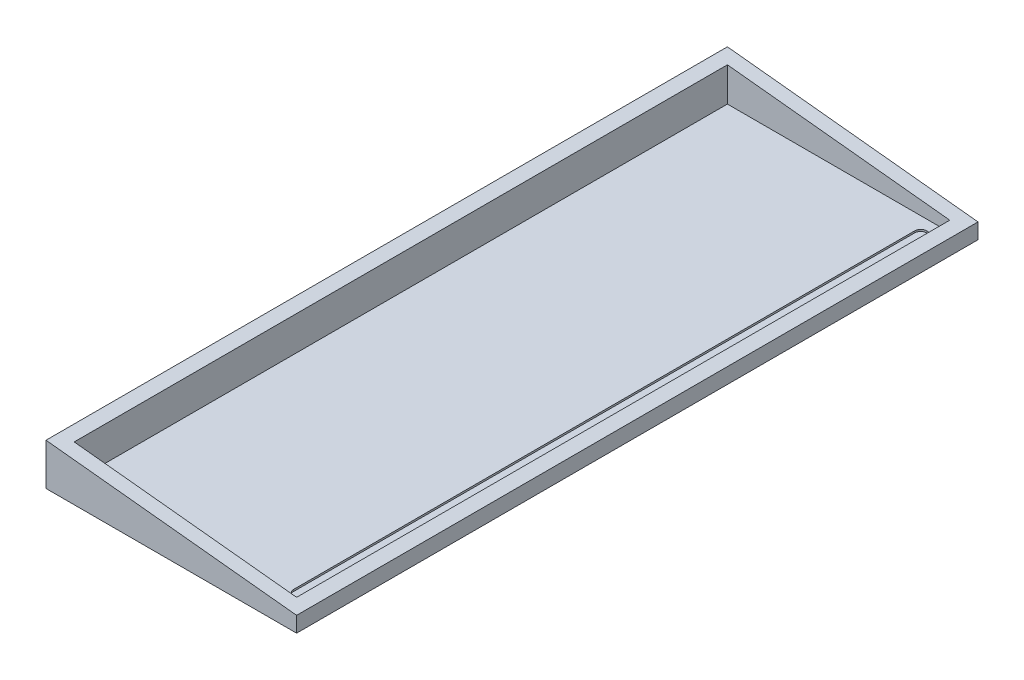
ISO-10303-21;
HEADER;
FILE_DESCRIPTION(('STEP AP214'),'2;1');
FILE_NAME('part.step','',(''),(''),'','','');
FILE_SCHEMA(('AUTOMOTIVE_DESIGN { 1 0 10303 214 1 1 1 1 }'));
ENDSEC;
DATA;
#1=APPLICATION_CONTEXT('core data for automotive mechanical design processes');
#2=APPLICATION_PROTOCOL_DEFINITION('international standard','automotive_design',2000,#1);
#3=PRODUCT_CONTEXT('',#1,'mechanical');
#4=PRODUCT('Part','Part','',(#3));
#5=PRODUCT_RELATED_PRODUCT_CATEGORY('part','',(#4));
#6=PRODUCT_DEFINITION_FORMATION('','',#4);
#7=PRODUCT_DEFINITION_CONTEXT('part definition',#1,'design');
#8=PRODUCT_DEFINITION('design','',#6,#7);
#9=PRODUCT_DEFINITION_SHAPE('','',#8);
#10=(LENGTH_UNIT() NAMED_UNIT(*) SI_UNIT(.MILLI.,.METRE.));
#11=(NAMED_UNIT(*) PLANE_ANGLE_UNIT() SI_UNIT($,.RADIAN.));
#12=(NAMED_UNIT(*) SI_UNIT($,.STERADIAN.) SOLID_ANGLE_UNIT());
#13=UNCERTAINTY_MEASURE_WITH_UNIT(LENGTH_MEASURE(1.E-05),#10,'distance_accuracy_value','');
#14=(GEOMETRIC_REPRESENTATION_CONTEXT(3) GLOBAL_UNCERTAINTY_ASSIGNED_CONTEXT((#13)) GLOBAL_UNIT_ASSIGNED_CONTEXT((#10,
#11,#12)) REPRESENTATION_CONTEXT('',''));
#15=CARTESIAN_POINT('',(0.,0.,0.));
#16=DIRECTION('',(0.,0.,1.));
#17=DIRECTION('',(1.,0.,0.));
#18=AXIS2_PLACEMENT_3D('',#15,#16,#17);
#19=CARTESIAN_POINT('',(1.80331095467036,15.6573576470199,0.));
#20=DIRECTION('',(0.104528463267646,0.994521895368274,0.));
#21=DIRECTION('',(-0.994521895368274,0.104528463267646,0.));
#22=AXIS2_PLACEMENT_3D('',#19,#20,#21);
#23=PLANE('',#22);
#24=DIRECTION('',(1.51465987561138E-13,0.,1.));
#25=VECTOR('',#24,1.);
#26=CARTESIAN_POINT('',(-61.4999999999144,22.3108037346864,9.6942194870283E-12));
#27=LINE('',#26,#25);
#28=CARTESIAN_POINT('',(-61.4999999999707,22.3108037346923,-372.27000000002));
#29=VERTEX_POINT('',#28);
#30=CARTESIAN_POINT('',(-61.499999999916,22.3108037346866,-11.0000000000191));
#31=VERTEX_POINT('',#30);
#32=EDGE_CURVE('E235',#29,#31,#27,.T.);
#33=ORIENTED_EDGE('',*,*,#32,.F.);
#34=DIRECTION('',(-0.994521895368274,0.104528463267646,0.));
#35=VECTOR('',#34,1.);
#36=CARTESIAN_POINT('',(1.80331095467036,15.6573576470199,-372.27000000002));
#37=LINE('',#36,#35);
#38=CARTESIAN_POINT('',(61.4999999999718,9.38298279702108,-372.27000000002));
#39=VERTEX_POINT('',#38);
#40=EDGE_CURVE('E162',#39,#29,#37,.T.);
#41=ORIENTED_EDGE('',*,*,#40,.F.);
#42=DIRECTION('',(0.,0.,-1.));
#43=VECTOR('',#42,1.);
#44=CARTESIAN_POINT('',(61.4999999999718,9.38298279702108,0.));
#45=LINE('',#44,#43);
#46=CARTESIAN_POINT('',(61.4999999999718,9.38298279702108,-11.0000000000191));
#47=VERTEX_POINT('',#46);
#48=EDGE_CURVE('E230',#47,#39,#45,.T.);
#49=ORIENTED_EDGE('',*,*,#48,.F.);
#50=DIRECTION('',(0.994521895368274,-0.104528463267646,0.));
#51=VECTOR('',#50,1.);
#52=CARTESIAN_POINT('',(1.80331095467036,15.6573576470199,-11.0000000000191));
#53=LINE('',#52,#51);
#54=EDGE_CURVE('E233',#31,#47,#53,.T.);
#55=ORIENTED_EDGE('',*,*,#54,.F.);
#56=EDGE_LOOP('',(#33,#41,#49,#55));
#57=FACE_BOUND('',#56,.T.);
#58=DIRECTION('',(-0.994521895368274,0.104528463267646,0.));
#59=VECTOR('',#58,1.);
#60=CARTESIAN_POINT('',(26.6325870070884,13.0476955753304,-3.19999999999993));
#61=LINE('',#60,#59);
#62=CARTESIAN_POINT('',(69.3,8.56316976194593,-3.19999999999993));
#63=VERTEX_POINT('',#62);
#64=CARTESIAN_POINT('',(-69.3,23.1306167697676,-3.19999999999993));
#65=VERTEX_POINT('',#64);
#66=EDGE_CURVE('E213',#63,#65,#61,.T.);
#67=ORIENTED_EDGE('',*,*,#66,.F.);
#68=DIRECTION('',(0.,0.,1.));
#69=VECTOR('',#68,1.);
#70=CARTESIAN_POINT('',(69.3,8.56316976194593,-380.07));
#71=LINE('',#70,#69);
#72=CARTESIAN_POINT('',(69.3,8.56316976194592,-380.07));
#73=VERTEX_POINT('',#72);
#74=EDGE_CURVE('E218',#73,#63,#71,.T.);
#75=ORIENTED_EDGE('',*,*,#74,.F.);
#76=DIRECTION('',(0.994521895368274,-0.104528463267646,0.));
#77=VECTOR('',#76,1.);
#78=CARTESIAN_POINT('',(-110.453041723765,27.4559757490001,-380.07));
#79=LINE('',#78,#77);
#80=CARTESIAN_POINT('',(-69.3,23.1306167697677,-380.07));
#81=VERTEX_POINT('',#80);
#82=EDGE_CURVE('E222',#81,#73,#79,.T.);
#83=ORIENTED_EDGE('',*,*,#82,.F.);
#84=DIRECTION('',(0.,0.,-1.));
#85=VECTOR('',#84,1.);
#86=CARTESIAN_POINT('',(-69.3,23.1306167697676,-3.19999999999993));
#87=LINE('',#86,#85);
#88=EDGE_CURVE('E201',#65,#81,#87,.T.);
#89=ORIENTED_EDGE('',*,*,#88,.F.);
#90=EDGE_LOOP('',(#67,#75,#83,#89));
#91=FACE_BOUND('',#90,.T.);
#92=ADVANCED_FACE('F45',(#57,#91),#23,.T.);
#93=CARTESIAN_POINT('',(0.,0.,0.));
#94=DIRECTION('',(0.,-1.,0.));
#95=DIRECTION('',(1.,0.,0.));
#96=AXIS2_PLACEMENT_3D('',#93,#94,#95);
#97=PLANE('',#96);
#98=DIRECTION('',(-1.,0.,0.));
#99=VECTOR('',#98,1.);
#100=CARTESIAN_POINT('',(69.3,0.,-3.19999999999993));
#101=LINE('',#100,#99);
#102=CARTESIAN_POINT('',(69.3,0.,-3.19999999999993));
#103=VERTEX_POINT('',#102);
#104=CARTESIAN_POINT('',(-69.3,0.,-3.19999999999993));
#105=VERTEX_POINT('',#104);
#106=EDGE_CURVE('E194',#103,#105,#101,.T.);
#107=ORIENTED_EDGE('',*,*,#106,.T.);
#108=DIRECTION('',(0.,0.,-1.));
#109=VECTOR('',#108,1.);
#110=CARTESIAN_POINT('',(-69.3,0.,-3.19999999999993));
#111=LINE('',#110,#109);
#112=CARTESIAN_POINT('',(-69.3,0.,-380.07));
#113=VERTEX_POINT('',#112);
#114=EDGE_CURVE('E205',#105,#113,#111,.T.);
#115=ORIENTED_EDGE('',*,*,#114,.T.);
#116=DIRECTION('',(1.,0.,0.));
#117=VECTOR('',#116,1.);
#118=CARTESIAN_POINT('',(-69.3,0.,-380.07));
#119=LINE('',#118,#117);
#120=CARTESIAN_POINT('',(69.3,0.,-380.07));
#121=VERTEX_POINT('',#120);
#122=EDGE_CURVE('E202',#113,#121,#119,.T.);
#123=ORIENTED_EDGE('',*,*,#122,.T.);
#124=DIRECTION('',(0.,0.,1.));
#125=VECTOR('',#124,1.);
#126=CARTESIAN_POINT('',(69.3,0.,-380.07));
#127=LINE('',#126,#125);
#128=EDGE_CURVE('E198',#121,#103,#127,.T.);
#129=ORIENTED_EDGE('',*,*,#128,.T.);
#130=EDGE_LOOP('',(#107,#115,#123,#129));
#131=FACE_BOUND('',#130,.T.);
#132=ADVANCED_FACE('F320',(#131),#97,.T.);
#133=CARTESIAN_POINT('',(-69.3,419.001013108752,-3.19999999999993));
#134=DIRECTION('',(-1.,0.,0.));
#135=DIRECTION('',(0.,0.,1.));
#136=AXIS2_PLACEMENT_3D('',#133,#134,#135);
#137=PLANE('',#136);
#138=DIRECTION('',(0.,-1.,0.));
#139=VECTOR('',#138,1.);
#140=CARTESIAN_POINT('',(-69.3,419.001013108752,-3.19999999999993));
#141=LINE('',#140,#139);
#142=EDGE_CURVE('E216',#65,#105,#141,.T.);
#143=ORIENTED_EDGE('',*,*,#142,.F.);
#144=ORIENTED_EDGE('',*,*,#88,.T.);
#145=DIRECTION('',(0.,-1.,0.));
#146=VECTOR('',#145,1.);
#147=CARTESIAN_POINT('',(-69.3,419.001013108752,-380.07));
#148=LINE('',#147,#146);
#149=EDGE_CURVE('E212',#81,#113,#148,.T.);
#150=ORIENTED_EDGE('',*,*,#149,.T.);
#151=ORIENTED_EDGE('',*,*,#114,.F.);
#152=EDGE_LOOP('',(#143,#144,#150,#151));
#153=FACE_BOUND('',#152,.T.);
#154=ADVANCED_FACE('F327',(#153),#137,.T.);
#155=CARTESIAN_POINT('',(-69.3,419.001013108752,-380.07));
#156=DIRECTION('',(0.,0.,-1.));
#157=DIRECTION('',(-1.,0.,0.));
#158=AXIS2_PLACEMENT_3D('',#155,#156,#157);
#159=PLANE('',#158);
#160=ORIENTED_EDGE('',*,*,#149,.F.);
#161=ORIENTED_EDGE('',*,*,#82,.T.);
#162=DIRECTION('',(0.,-1.,0.));
#163=VECTOR('',#162,1.);
#164=CARTESIAN_POINT('',(69.3,419.001013108752,-380.07));
#165=LINE('',#164,#163);
#166=EDGE_CURVE('E221',#73,#121,#165,.T.);
#167=ORIENTED_EDGE('',*,*,#166,.T.);
#168=ORIENTED_EDGE('',*,*,#122,.F.);
#169=EDGE_LOOP('',(#160,#161,#167,#168));
#170=FACE_BOUND('',#169,.T.);
#171=ADVANCED_FACE('F444',(#170),#159,.T.);
#172=CARTESIAN_POINT('',(69.3,419.001013108752,-380.07));
#173=DIRECTION('',(1.,0.,0.));
#174=DIRECTION('',(0.,1.,0.));
#175=AXIS2_PLACEMENT_3D('',#172,#173,#174);
#176=PLANE('',#175);
#177=ORIENTED_EDGE('',*,*,#166,.F.);
#178=ORIENTED_EDGE('',*,*,#74,.T.);
#179=DIRECTION('',(0.,-1.,0.));
#180=VECTOR('',#179,1.);
#181=CARTESIAN_POINT('',(69.3,419.001013108752,-3.19999999999993));
#182=LINE('',#181,#180);
#183=EDGE_CURVE('E217',#63,#103,#182,.T.);
#184=ORIENTED_EDGE('',*,*,#183,.T.);
#185=ORIENTED_EDGE('',*,*,#128,.F.);
#186=EDGE_LOOP('',(#177,#178,#184,#185));
#187=FACE_BOUND('',#186,.T.);
#188=ADVANCED_FACE('F448',(#187),#176,.T.);
#189=CARTESIAN_POINT('',(69.3,419.001013108752,-3.19999999999993));
#190=DIRECTION('',(0.,0.,1.));
#191=DIRECTION('',(1.,0.,0.));
#192=AXIS2_PLACEMENT_3D('',#189,#190,#191);
#193=PLANE('',#192);
#194=ORIENTED_EDGE('',*,*,#183,.F.);
#195=ORIENTED_EDGE('',*,*,#66,.T.);
#196=ORIENTED_EDGE('',*,*,#142,.T.);
#197=ORIENTED_EDGE('',*,*,#106,.F.);
#198=EDGE_LOOP('',(#194,#195,#196,#197));
#199=FACE_BOUND('',#198,.T.);
#200=ADVANCED_FACE('F436',(#199),#193,.T.);
#201=CARTESIAN_POINT('',(-61.499999999916,31.,-11.0000000000191));
#202=DIRECTION('',(-1.,0.,1.51465987561138E-13));
#203=DIRECTION('',(1.51465987561138E-13,0.,1.));
#204=AXIS2_PLACEMENT_3D('',#201,#202,#203);
#205=PLANE('',#204);
#206=ORIENTED_EDGE('',*,*,#32,.T.);
#207=DIRECTION('',(0.,-1.,0.));
#208=VECTOR('',#207,1.);
#209=CARTESIAN_POINT('',(-61.499999999916,31.,-11.0000000000191));
#210=LINE('',#209,#208);
#211=CARTESIAN_POINT('',(-61.499999999916,3.5,-11.0000000000191));
#212=VERTEX_POINT('',#211);
#213=EDGE_CURVE('E181',#31,#212,#210,.T.);
#214=ORIENTED_EDGE('',*,*,#213,.T.);
#215=DIRECTION('',(-1.51465987561138E-13,0.,-1.));
#216=VECTOR('',#215,1.);
#217=CARTESIAN_POINT('',(-61.499999999916,3.5,-11.0000000000191));
#218=LINE('',#217,#216);
#219=CARTESIAN_POINT('',(-61.4999999999707,3.5,-372.27000000002));
#220=VERTEX_POINT('',#219);
#221=EDGE_CURVE('E174',#212,#220,#218,.T.);
#222=ORIENTED_EDGE('',*,*,#221,.T.);
#223=DIRECTION('',(0.,-1.,0.));
#224=VECTOR('',#223,1.);
#225=CARTESIAN_POINT('',(-61.4999999999707,31.,-372.27000000002));
#226=LINE('',#225,#224);
#227=EDGE_CURVE('E157',#29,#220,#226,.T.);
#228=ORIENTED_EDGE('',*,*,#227,.F.);
#229=EDGE_LOOP('',(#206,#214,#222,#228));
#230=FACE_BOUND('',#229,.T.);
#231=ADVANCED_FACE('F179',(#230),#205,.F.);
#232=CARTESIAN_POINT('',(61.4999999999718,31.,-11.0000000000191));
#233=DIRECTION('',(0.,0.,1.));
#234=DIRECTION('',(1.,0.,0.));
#235=AXIS2_PLACEMENT_3D('',#232,#233,#234);
#236=PLANE('',#235);
#237=ORIENTED_EDGE('',*,*,#54,.T.);
#238=DIRECTION('',(0.,-1.,0.));
#239=VECTOR('',#238,1.);
#240=CARTESIAN_POINT('',(61.4999999999718,31.,-11.0000000000191));
#241=LINE('',#240,#239);
#242=CARTESIAN_POINT('',(61.4999999999718,3.5,-11.0000000000191));
#243=VERTEX_POINT('',#242);
#244=EDGE_CURVE('E195',#47,#243,#241,.T.);
#245=ORIENTED_EDGE('',*,*,#244,.T.);
#246=DIRECTION('',(-1.,0.,0.));
#247=VECTOR('',#246,1.);
#248=CARTESIAN_POINT('',(61.4999999999718,3.5,-11.0000000000191));
#249=LINE('',#248,#247);
#250=EDGE_CURVE('E167',#243,#212,#249,.T.);
#251=ORIENTED_EDGE('',*,*,#250,.T.);
#252=ORIENTED_EDGE('',*,*,#213,.F.);
#253=EDGE_LOOP('',(#237,#245,#251,#252));
#254=FACE_BOUND('',#253,.T.);
#255=ADVANCED_FACE('F413',(#254),#236,.F.);
#256=CARTESIAN_POINT('',(61.4999999999718,31.,-372.27000000002));
#257=DIRECTION('',(1.,0.,0.));
#258=DIRECTION('',(0.,1.,0.));
#259=AXIS2_PLACEMENT_3D('',#256,#257,#258);
#260=PLANE('',#259);
#261=ORIENTED_EDGE('',*,*,#48,.T.);
#262=DIRECTION('',(0.,-1.,0.));
#263=VECTOR('',#262,1.);
#264=CARTESIAN_POINT('',(61.4999999999718,31.,-372.27000000002));
#265=LINE('',#264,#263);
#266=CARTESIAN_POINT('',(61.4999999999718,3.5,-372.27000000002));
#267=VERTEX_POINT('',#266);
#268=EDGE_CURVE('E166',#39,#267,#265,.T.);
#269=ORIENTED_EDGE('',*,*,#268,.T.);
#270=DIRECTION('',(0.,0.,1.));
#271=VECTOR('',#270,1.);
#272=CARTESIAN_POINT('',(61.4999999999718,3.5,-372.27000000002));
#273=LINE('',#272,#271);
#274=EDGE_CURVE('E177',#267,#243,#273,.T.);
#275=ORIENTED_EDGE('',*,*,#274,.T.);
#276=ORIENTED_EDGE('',*,*,#244,.F.);
#277=EDGE_LOOP('',(#261,#269,#275,#276));
#278=FACE_BOUND('',#277,.T.);
#279=ADVANCED_FACE('F408',(#278),#260,.F.);
#280=CARTESIAN_POINT('',(-61.4999999999707,31.,-372.27000000002));
#281=DIRECTION('',(0.,0.,-1.));
#282=DIRECTION('',(-1.,0.,0.));
#283=AXIS2_PLACEMENT_3D('',#280,#281,#282);
#284=PLANE('',#283);
#285=ORIENTED_EDGE('',*,*,#40,.T.);
#286=ORIENTED_EDGE('',*,*,#227,.T.);
#287=DIRECTION('',(1.,0.,0.));
#288=VECTOR('',#287,1.);
#289=CARTESIAN_POINT('',(-61.4999999999707,3.5,-372.27000000002));
#290=LINE('',#289,#288);
#291=EDGE_CURVE('E160',#220,#267,#290,.T.);
#292=ORIENTED_EDGE('',*,*,#291,.T.);
#293=ORIENTED_EDGE('',*,*,#268,.F.);
#294=EDGE_LOOP('',(#285,#286,#292,#293));
#295=FACE_BOUND('',#294,.T.);
#296=ADVANCED_FACE('F159',(#295),#284,.F.);
#297=CARTESIAN_POINT('',(0.,3.5,0.));
#298=DIRECTION('',(0.,-1.,0.));
#299=DIRECTION('',(1.,0.,0.));
#300=AXIS2_PLACEMENT_3D('',#297,#298,#299);
#301=PLANE('',#300);
#302=DIRECTION('',(-1.,0.,0.));
#303=VECTOR('',#302,1.);
#304=CARTESIAN_POINT('',(60.9999999999718,3.5,-366.635000000019));
#305=LINE('',#304,#303);
#306=CARTESIAN_POINT('',(57.7499999999718,3.5,-366.635000000019));
#307=VERTEX_POINT('',#306);
#308=CARTESIAN_POINT('',(54.2499999999718,3.5,-366.635000000019));
#309=VERTEX_POINT('',#308);
#310=EDGE_CURVE('E298',#307,#309,#305,.T.);
#311=ORIENTED_EDGE('',*,*,#310,.F.);
#312=CARTESIAN_POINT('',(57.7499999999718,3.5,-363.385000000019));
#313=DIRECTION('',(0.,-1.,0.));
#314=DIRECTION('',(1.,0.,0.));
#315=AXIS2_PLACEMENT_3D('',#312,#313,#314);
#316=CIRCLE('',#315,3.25);
#317=CARTESIAN_POINT('',(60.9999999999718,3.5,-363.385000000019));
#318=VERTEX_POINT('',#317);
#319=EDGE_CURVE('E12',#307,#318,#316,.T.);
#320=ORIENTED_EDGE('',*,*,#319,.T.);
#321=DIRECTION('',(0.,0.,-1.));
#322=VECTOR('',#321,1.);
#323=CARTESIAN_POINT('',(60.9999999999718,3.5,-366.635000000019));
#324=LINE('',#323,#322);
#325=CARTESIAN_POINT('',(60.9999999999718,3.5,-19.8850000000193));
#326=VERTEX_POINT('',#325);
#327=EDGE_CURVE('E271',#326,#318,#324,.T.);
#328=ORIENTED_EDGE('',*,*,#327,.F.);
#329=CARTESIAN_POINT('',(57.7499999999718,3.5,-19.8850000000193));
#330=DIRECTION('',(0.,-1.,0.));
#331=DIRECTION('',(1.,0.,0.));
#332=AXIS2_PLACEMENT_3D('',#329,#330,#331);
#333=CIRCLE('',#332,3.25);
#334=CARTESIAN_POINT('',(57.7499999999718,3.5,-16.6350000000193));
#335=VERTEX_POINT('',#334);
#336=EDGE_CURVE('E266',#326,#335,#333,.T.);
#337=ORIENTED_EDGE('',*,*,#336,.T.);
#338=DIRECTION('',(1.,0.,0.));
#339=VECTOR('',#338,1.);
#340=CARTESIAN_POINT('',(60.9999999999718,3.5,-16.6350000000193));
#341=LINE('',#340,#339);
#342=CARTESIAN_POINT('',(54.2499999999718,3.5,-16.6350000000193));
#343=VERTEX_POINT('',#342);
#344=EDGE_CURVE('E188',#343,#335,#341,.T.);
#345=ORIENTED_EDGE('',*,*,#344,.F.);
#346=CARTESIAN_POINT('',(54.2499999999718,3.5,-19.8850000000193));
#347=DIRECTION('',(0.,-1.,0.));
#348=DIRECTION('',(1.,0.,0.));
#349=AXIS2_PLACEMENT_3D('',#346,#347,#348);
#350=CIRCLE('',#349,3.25);
#351=CARTESIAN_POINT('',(50.9999999999718,3.5,-19.8850000000193));
#352=VERTEX_POINT('',#351);
#353=EDGE_CURVE('E264',#343,#352,#350,.T.);
#354=ORIENTED_EDGE('',*,*,#353,.T.);
#355=DIRECTION('',(0.,0.,1.));
#356=VECTOR('',#355,1.);
#357=CARTESIAN_POINT('',(50.9999999999718,3.5,-366.635000000019));
#358=LINE('',#357,#356);
#359=CARTESIAN_POINT('',(50.9999999999718,3.5,-363.385000000019));
#360=VERTEX_POINT('',#359);
#361=EDGE_CURVE('E280',#360,#352,#358,.T.);
#362=ORIENTED_EDGE('',*,*,#361,.F.);
#363=CARTESIAN_POINT('',(54.2499999999718,3.5,-363.385000000019));
#364=DIRECTION('',(0.,-1.,0.));
#365=DIRECTION('',(1.,0.,0.));
#366=AXIS2_PLACEMENT_3D('',#363,#364,#365);
#367=CIRCLE('',#366,3.25);
#368=EDGE_CURVE('E53',#360,#309,#367,.T.);
#369=ORIENTED_EDGE('',*,*,#368,.T.);
#370=EDGE_LOOP('',(#311,#320,#328,#337,#345,#354,#362,#369));
#371=FACE_BOUND('',#370,.T.);
#372=ORIENTED_EDGE('',*,*,#221,.F.);
#373=ORIENTED_EDGE('',*,*,#250,.F.);
#374=ORIENTED_EDGE('',*,*,#274,.F.);
#375=ORIENTED_EDGE('',*,*,#291,.F.);
#376=EDGE_LOOP('',(#372,#373,#374,#375));
#377=FACE_BOUND('',#376,.T.);
#378=ADVANCED_FACE('F172',(#371,#377),#301,.F.);
#379=CARTESIAN_POINT('',(60.9999999999718,2.5,-366.635000000019));
#380=DIRECTION('',(1.,0.,0.));
#381=DIRECTION('',(0.,1.,0.));
#382=AXIS2_PLACEMENT_3D('',#379,#380,#381);
#383=PLANE('',#382);
#384=DIRECTION('',(0.,0.,-1.));
#385=VECTOR('',#384,1.);
#386=CARTESIAN_POINT('',(60.9999999999718,2.5,-366.635000000019));
#387=LINE('',#386,#385);
#388=CARTESIAN_POINT('',(60.9999999999718,2.5,-19.8850000000193));
#389=VERTEX_POINT('',#388);
#390=CARTESIAN_POINT('',(60.9999999999718,2.5,-363.385000000019));
#391=VERTEX_POINT('',#390);
#392=EDGE_CURVE('E279',#389,#391,#387,.T.);
#393=ORIENTED_EDGE('',*,*,#392,.F.);
#394=DIRECTION('',(0.,1.,0.));
#395=VECTOR('',#394,1.);
#396=CARTESIAN_POINT('',(60.9999999999718,3.5,-19.8850000000193));
#397=LINE('',#396,#395);
#398=EDGE_CURVE('E257',#389,#326,#397,.T.);
#399=ORIENTED_EDGE('',*,*,#398,.T.);
#400=ORIENTED_EDGE('',*,*,#327,.T.);
#401=DIRECTION('',(0.,1.,0.));
#402=VECTOR('',#401,1.);
#403=CARTESIAN_POINT('',(60.9999999999718,2.5,-363.385000000019));
#404=LINE('',#403,#402);
#405=EDGE_CURVE('E255',#318,#391,#404,.F.);
#406=ORIENTED_EDGE('',*,*,#405,.T.);
#407=EDGE_LOOP('',(#393,#399,#400,#406));
#408=FACE_BOUND('',#407,.T.);
#409=ADVANCED_FACE('F290',(#408),#383,.F.);
#410=CARTESIAN_POINT('',(60.9999999999718,2.5,-16.6350000000193));
#411=DIRECTION('',(0.,0.,1.));
#412=DIRECTION('',(0.,-1.,0.));
#413=AXIS2_PLACEMENT_3D('',#410,#411,#412);
#414=PLANE('',#413);
#415=DIRECTION('',(1.,0.,0.));
#416=VECTOR('',#415,1.);
#417=CARTESIAN_POINT('',(60.9999999999718,2.5,-16.6350000000193));
#418=LINE('',#417,#416);
#419=CARTESIAN_POINT('',(54.2499999999718,2.5,-16.6350000000193));
#420=VERTEX_POINT('',#419);
#421=CARTESIAN_POINT('',(57.7499999999718,2.5,-16.6350000000193));
#422=VERTEX_POINT('',#421);
#423=EDGE_CURVE('E182',#420,#422,#418,.T.);
#424=ORIENTED_EDGE('',*,*,#423,.F.);
#425=DIRECTION('',(0.,1.,0.));
#426=VECTOR('',#425,1.);
#427=CARTESIAN_POINT('',(54.2499999999718,3.5,-16.6350000000193));
#428=LINE('',#427,#426);
#429=EDGE_CURVE('E239',#420,#343,#428,.T.);
#430=ORIENTED_EDGE('',*,*,#429,.T.);
#431=ORIENTED_EDGE('',*,*,#344,.T.);
#432=DIRECTION('',(0.,1.,0.));
#433=VECTOR('',#432,1.);
#434=CARTESIAN_POINT('',(57.7499999999718,2.5,-16.6350000000193));
#435=LINE('',#434,#433);
#436=EDGE_CURVE('E237',#335,#422,#435,.F.);
#437=ORIENTED_EDGE('',*,*,#436,.T.);
#438=EDGE_LOOP('',(#424,#430,#431,#437));
#439=FACE_BOUND('',#438,.T.);
#440=ADVANCED_FACE('F277',(#439),#414,.F.);
#441=CARTESIAN_POINT('',(50.9999999999718,2.5,-366.635000000019));
#442=DIRECTION('',(-1.,0.,0.));
#443=DIRECTION('',(0.,-1.,0.));
#444=AXIS2_PLACEMENT_3D('',#441,#442,#443);
#445=PLANE('',#444);
#446=ORIENTED_EDGE('',*,*,#361,.T.);
#447=DIRECTION('',(0.,1.,0.));
#448=VECTOR('',#447,1.);
#449=CARTESIAN_POINT('',(50.9999999999718,2.5,-19.8850000000193));
#450=LINE('',#449,#448);
#451=CARTESIAN_POINT('',(50.9999999999718,2.5,-19.8850000000193));
#452=VERTEX_POINT('',#451);
#453=EDGE_CURVE('E245',#352,#452,#450,.F.);
#454=ORIENTED_EDGE('',*,*,#453,.T.);
#455=DIRECTION('',(0.,0.,1.));
#456=VECTOR('',#455,1.);
#457=CARTESIAN_POINT('',(50.9999999999718,2.5,-366.635000000019));
#458=LINE('',#457,#456);
#459=CARTESIAN_POINT('',(50.9999999999718,2.5,-363.385000000019));
#460=VERTEX_POINT('',#459);
#461=EDGE_CURVE('E185',#460,#452,#458,.T.);
#462=ORIENTED_EDGE('',*,*,#461,.F.);
#463=DIRECTION('',(0.,1.,0.));
#464=VECTOR('',#463,1.);
#465=CARTESIAN_POINT('',(50.9999999999718,3.5,-363.385000000019));
#466=LINE('',#465,#464);
#467=EDGE_CURVE('E242',#460,#360,#466,.T.);
#468=ORIENTED_EDGE('',*,*,#467,.T.);
#469=EDGE_LOOP('',(#446,#454,#462,#468));
#470=FACE_BOUND('',#469,.T.);
#471=ADVANCED_FACE('F302',(#470),#445,.F.);
#472=CARTESIAN_POINT('',(60.9999999999718,2.5,-366.635000000019));
#473=DIRECTION('',(0.,0.,-1.));
#474=DIRECTION('',(0.,1.,0.));
#475=AXIS2_PLACEMENT_3D('',#472,#473,#474);
#476=PLANE('',#475);
#477=ORIENTED_EDGE('',*,*,#310,.T.);
#478=DIRECTION('',(0.,1.,0.));
#479=VECTOR('',#478,1.);
#480=CARTESIAN_POINT('',(54.2499999999718,2.5,-366.635000000019));
#481=LINE('',#480,#479);
#482=CARTESIAN_POINT('',(54.2499999999718,2.5,-366.635000000019));
#483=VERTEX_POINT('',#482);
#484=EDGE_CURVE('E262',#309,#483,#481,.F.);
#485=ORIENTED_EDGE('',*,*,#484,.T.);
#486=DIRECTION('',(-1.,0.,0.));
#487=VECTOR('',#486,1.);
#488=CARTESIAN_POINT('',(60.9999999999718,2.5,-366.635000000019));
#489=LINE('',#488,#487);
#490=CARTESIAN_POINT('',(57.7499999999718,2.5,-366.635000000019));
#491=VERTEX_POINT('',#490);
#492=EDGE_CURVE('E291',#491,#483,#489,.T.);
#493=ORIENTED_EDGE('',*,*,#492,.F.);
#494=DIRECTION('',(0.,1.,0.));
#495=VECTOR('',#494,1.);
#496=CARTESIAN_POINT('',(57.7499999999718,3.5,-366.635000000019));
#497=LINE('',#496,#495);
#498=EDGE_CURVE('E260',#491,#307,#497,.T.);
#499=ORIENTED_EDGE('',*,*,#498,.T.);
#500=EDGE_LOOP('',(#477,#485,#493,#499));
#501=FACE_BOUND('',#500,.T.);
#502=ADVANCED_FACE('F314',(#501),#476,.F.);
#503=CARTESIAN_POINT('',(0.,2.5,0.));
#504=DIRECTION('',(0.,-1.,0.));
#505=DIRECTION('',(0.,0.,-1.));
#506=AXIS2_PLACEMENT_3D('',#503,#504,#505);
#507=PLANE('',#506);
#508=ORIENTED_EDGE('',*,*,#461,.T.);
#509=CARTESIAN_POINT('',(54.2499999999718,2.5,-19.8850000000193));
#510=DIRECTION('',(0.,-1.,0.));
#511=DIRECTION('',(0.,0.,-1.));
#512=AXIS2_PLACEMENT_3D('',#509,#510,#511);
#513=CIRCLE('',#512,3.25);
#514=EDGE_CURVE('E253',#452,#420,#513,.F.);
#515=ORIENTED_EDGE('',*,*,#514,.T.);
#516=ORIENTED_EDGE('',*,*,#423,.T.);
#517=CARTESIAN_POINT('',(57.7499999999718,2.5,-19.8850000000193));
#518=DIRECTION('',(0.,-1.,0.));
#519=DIRECTION('',(0.,0.,-1.));
#520=AXIS2_PLACEMENT_3D('',#517,#518,#519);
#521=CIRCLE('',#520,3.25);
#522=EDGE_CURVE('E251',#422,#389,#521,.F.);
#523=ORIENTED_EDGE('',*,*,#522,.T.);
#524=ORIENTED_EDGE('',*,*,#392,.T.);
#525=CARTESIAN_POINT('',(57.7499999999718,2.5,-363.385000000019));
#526=DIRECTION('',(0.,-1.,0.));
#527=DIRECTION('',(0.,0.,-1.));
#528=AXIS2_PLACEMENT_3D('',#525,#526,#527);
#529=CIRCLE('',#528,3.25);
#530=EDGE_CURVE('E247',#391,#491,#529,.F.);
#531=ORIENTED_EDGE('',*,*,#530,.T.);
#532=ORIENTED_EDGE('',*,*,#492,.T.);
#533=CARTESIAN_POINT('',(54.2499999999718,2.5,-363.385000000019));
#534=DIRECTION('',(0.,-1.,0.));
#535=DIRECTION('',(0.,0.,-1.));
#536=AXIS2_PLACEMENT_3D('',#533,#534,#535);
#537=CIRCLE('',#536,3.25);
#538=EDGE_CURVE('E249',#483,#460,#537,.F.);
#539=ORIENTED_EDGE('',*,*,#538,.T.);
#540=EDGE_LOOP('',(#508,#515,#516,#523,#524,#531,#532,#539));
#541=FACE_BOUND('',#540,.T.);
#542=ADVANCED_FACE('F287',(#541),#507,.F.);
#543=CARTESIAN_POINT('',(54.2499999999718,2.5,-19.8850000000193));
#544=DIRECTION('',(0.,-1.,0.));
#545=DIRECTION('',(1.,0.,0.));
#546=AXIS2_PLACEMENT_3D('',#543,#544,#545);
#547=CYLINDRICAL_SURFACE('',#546,3.25);
#548=ORIENTED_EDGE('',*,*,#514,.F.);
#549=ORIENTED_EDGE('',*,*,#453,.F.);
#550=ORIENTED_EDGE('',*,*,#353,.F.);
#551=ORIENTED_EDGE('',*,*,#429,.F.);
#552=EDGE_LOOP('',(#548,#549,#550,#551));
#553=FACE_BOUND('',#552,.T.);
#554=ADVANCED_FACE('F307',(#553),#547,.F.);
#555=CARTESIAN_POINT('',(57.7499999999718,2.5,-19.8850000000193));
#556=DIRECTION('',(0.,-1.,0.));
#557=DIRECTION('',(1.,0.,0.));
#558=AXIS2_PLACEMENT_3D('',#555,#556,#557);
#559=CYLINDRICAL_SURFACE('',#558,3.25);
#560=ORIENTED_EDGE('',*,*,#522,.F.);
#561=ORIENTED_EDGE('',*,*,#436,.F.);
#562=ORIENTED_EDGE('',*,*,#336,.F.);
#563=ORIENTED_EDGE('',*,*,#398,.F.);
#564=EDGE_LOOP('',(#560,#561,#562,#563));
#565=FACE_BOUND('',#564,.T.);
#566=ADVANCED_FACE('F282',(#565),#559,.F.);
#567=CARTESIAN_POINT('',(54.2499999999718,2.5,-363.385000000019));
#568=DIRECTION('',(0.,-1.,0.));
#569=DIRECTION('',(1.,0.,0.));
#570=AXIS2_PLACEMENT_3D('',#567,#568,#569);
#571=CYLINDRICAL_SURFACE('',#570,3.25);
#572=ORIENTED_EDGE('',*,*,#538,.F.);
#573=ORIENTED_EDGE('',*,*,#484,.F.);
#574=ORIENTED_EDGE('',*,*,#368,.F.);
#575=ORIENTED_EDGE('',*,*,#467,.F.);
#576=EDGE_LOOP('',(#572,#573,#574,#575));
#577=FACE_BOUND('',#576,.T.);
#578=ADVANCED_FACE('F310',(#577),#571,.F.);
#579=CARTESIAN_POINT('',(57.7499999999718,2.5,-363.385000000019));
#580=DIRECTION('',(0.,-1.,0.));
#581=DIRECTION('',(1.,0.,0.));
#582=AXIS2_PLACEMENT_3D('',#579,#580,#581);
#583=CYLINDRICAL_SURFACE('',#582,3.25);
#584=ORIENTED_EDGE('',*,*,#530,.F.);
#585=ORIENTED_EDGE('',*,*,#405,.F.);
#586=ORIENTED_EDGE('',*,*,#319,.F.);
#587=ORIENTED_EDGE('',*,*,#498,.F.);
#588=EDGE_LOOP('',(#584,#585,#586,#587));
#589=FACE_BOUND('',#588,.T.);
#590=ADVANCED_FACE('F47',(#589),#583,.F.);
#591=CLOSED_SHELL('',(#92,#132,#154,#171,#188,#200,#231,#255,#279,#296,#378,#409,#440,#471,#502,
#542,#554,#566,#578,#590));
#592=MANIFOLD_SOLID_BREP('B2',#591);
#593=ADVANCED_BREP_SHAPE_REPRESENTATION('',(#18,#592),#14);
#594=SHAPE_DEFINITION_REPRESENTATION(#9,#593);
ENDSEC;
END-ISO-10303-21;
